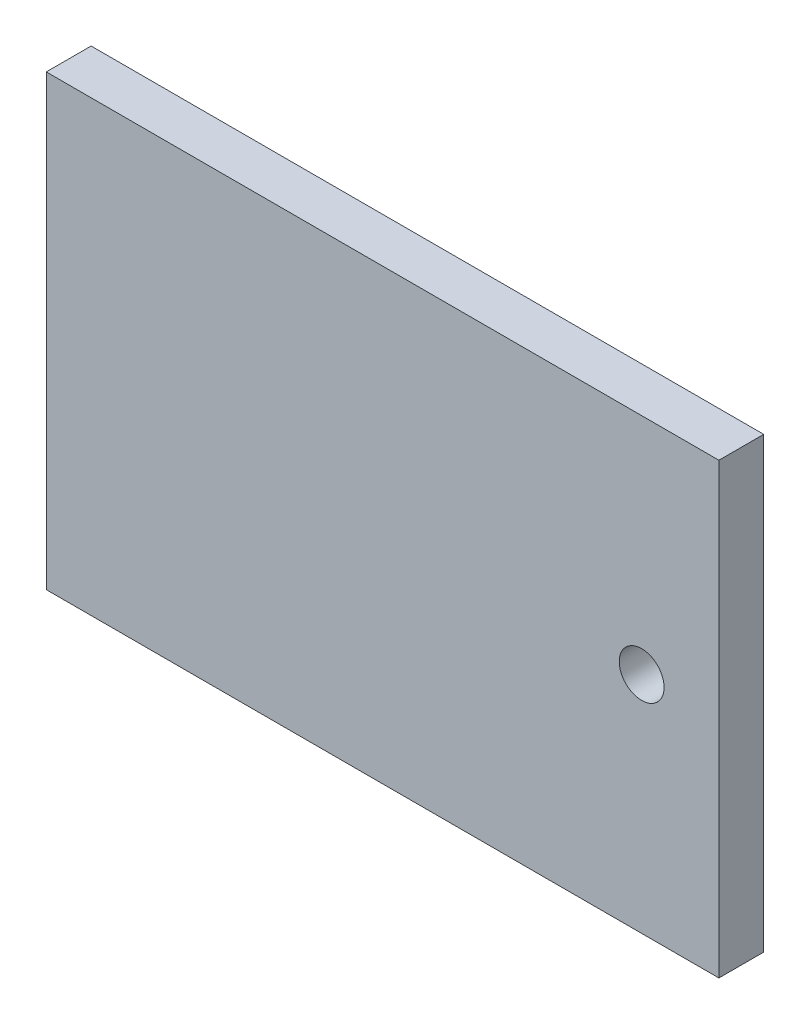
ISO-10303-21;
HEADER;
FILE_DESCRIPTION(('STEP AP214'),'2;1');
FILE_NAME('part.step','',(''),(''),'','','');
FILE_SCHEMA(('AUTOMOTIVE_DESIGN { 1 0 10303 214 1 1 1 1 }'));
ENDSEC;
DATA;
#1=APPLICATION_CONTEXT('core data for automotive mechanical design processes');
#2=APPLICATION_PROTOCOL_DEFINITION('international standard','automotive_design',2000,#1);
#3=PRODUCT_CONTEXT('',#1,'mechanical');
#4=PRODUCT('Part','Part','',(#3));
#5=PRODUCT_RELATED_PRODUCT_CATEGORY('part','',(#4));
#6=PRODUCT_DEFINITION_FORMATION('','',#4);
#7=PRODUCT_DEFINITION_CONTEXT('part definition',#1,'design');
#8=PRODUCT_DEFINITION('design','',#6,#7);
#9=PRODUCT_DEFINITION_SHAPE('','',#8);
#10=(LENGTH_UNIT() NAMED_UNIT(*) SI_UNIT(.MILLI.,.METRE.));
#11=(NAMED_UNIT(*) PLANE_ANGLE_UNIT() SI_UNIT($,.RADIAN.));
#12=(NAMED_UNIT(*) SI_UNIT($,.STERADIAN.) SOLID_ANGLE_UNIT());
#13=UNCERTAINTY_MEASURE_WITH_UNIT(LENGTH_MEASURE(1.E-05),#10,'distance_accuracy_value','');
#14=(GEOMETRIC_REPRESENTATION_CONTEXT(3) GLOBAL_UNCERTAINTY_ASSIGNED_CONTEXT((#13)) GLOBAL_UNIT_ASSIGNED_CONTEXT((#10,
#11,#12)) REPRESENTATION_CONTEXT('',''));
#15=CARTESIAN_POINT('',(0.,0.,0.));
#16=DIRECTION('',(0.,0.,1.));
#17=DIRECTION('',(1.,0.,0.));
#18=AXIS2_PLACEMENT_3D('',#15,#16,#17);
#19=CARTESIAN_POINT('',(15.,10.,2.));
#20=DIRECTION('',(-1.,0.,0.));
#21=DIRECTION('',(0.,-1.,0.));
#22=AXIS2_PLACEMENT_3D('',#19,#20,#21);
#23=PLANE('',#22);
#24=DIRECTION('',(0.,1.,0.));
#25=VECTOR('',#24,1.);
#26=CARTESIAN_POINT('',(15.,10.,0.));
#27=LINE('',#26,#25);
#28=CARTESIAN_POINT('',(15.,-10.,0.));
#29=VERTEX_POINT('',#28);
#30=CARTESIAN_POINT('',(15.,10.,0.));
#31=VERTEX_POINT('',#30);
#32=EDGE_CURVE('E111',#29,#31,#27,.T.);
#33=ORIENTED_EDGE('',*,*,#32,.T.);
#34=DIRECTION('',(0.,0.,-1.));
#35=VECTOR('',#34,1.);
#36=CARTESIAN_POINT('',(15.,10.,2.));
#37=LINE('',#36,#35);
#38=CARTESIAN_POINT('',(15.,10.,2.));
#39=VERTEX_POINT('',#38);
#40=EDGE_CURVE('E11',#39,#31,#37,.T.);
#41=ORIENTED_EDGE('',*,*,#40,.F.);
#42=DIRECTION('',(0.,1.,0.));
#43=VECTOR('',#42,1.);
#44=CARTESIAN_POINT('',(15.,10.,2.));
#45=LINE('',#44,#43);
#46=CARTESIAN_POINT('',(15.,-10.,2.));
#47=VERTEX_POINT('',#46);
#48=EDGE_CURVE('E95',#47,#39,#45,.T.);
#49=ORIENTED_EDGE('',*,*,#48,.F.);
#50=DIRECTION('',(0.,0.,-1.));
#51=VECTOR('',#50,1.);
#52=CARTESIAN_POINT('',(15.,-10.,2.));
#53=LINE('',#52,#51);
#54=EDGE_CURVE('E107',#47,#29,#53,.T.);
#55=ORIENTED_EDGE('',*,*,#54,.T.);
#56=EDGE_LOOP('',(#33,#41,#49,#55));
#57=FACE_BOUND('',#56,.T.);
#58=ADVANCED_FACE('F43',(#57),#23,.F.);
#59=CARTESIAN_POINT('',(-15.,10.,2.));
#60=DIRECTION('',(0.,-1.,0.));
#61=DIRECTION('',(0.,0.,-1.));
#62=AXIS2_PLACEMENT_3D('',#59,#60,#61);
#63=PLANE('',#62);
#64=DIRECTION('',(-1.,0.,0.));
#65=VECTOR('',#64,1.);
#66=CARTESIAN_POINT('',(-15.,10.,0.));
#67=LINE('',#66,#65);
#68=CARTESIAN_POINT('',(-15.,10.,0.));
#69=VERTEX_POINT('',#68);
#70=EDGE_CURVE('E100',#31,#69,#67,.T.);
#71=ORIENTED_EDGE('',*,*,#70,.T.);
#72=DIRECTION('',(0.,0.,-1.));
#73=VECTOR('',#72,1.);
#74=CARTESIAN_POINT('',(-15.,10.,2.));
#75=LINE('',#74,#73);
#76=CARTESIAN_POINT('',(-15.,10.,2.));
#77=VERTEX_POINT('',#76);
#78=EDGE_CURVE('E52',#77,#69,#75,.T.);
#79=ORIENTED_EDGE('',*,*,#78,.F.);
#80=DIRECTION('',(-1.,0.,0.));
#81=VECTOR('',#80,1.);
#82=CARTESIAN_POINT('',(-15.,10.,2.));
#83=LINE('',#82,#81);
#84=EDGE_CURVE('E90',#39,#77,#83,.T.);
#85=ORIENTED_EDGE('',*,*,#84,.F.);
#86=ORIENTED_EDGE('',*,*,#40,.T.);
#87=EDGE_LOOP('',(#71,#79,#85,#86));
#88=FACE_BOUND('',#87,.T.);
#89=ADVANCED_FACE('F99',(#88),#63,.F.);
#90=CARTESIAN_POINT('',(-15.,10.,2.));
#91=DIRECTION('',(1.,0.,0.));
#92=DIRECTION('',(0.,1.,0.));
#93=AXIS2_PLACEMENT_3D('',#90,#91,#92);
#94=PLANE('',#93);
#95=DIRECTION('',(0.,-1.,0.));
#96=VECTOR('',#95,1.);
#97=CARTESIAN_POINT('',(-15.,10.,0.));
#98=LINE('',#97,#96);
#99=CARTESIAN_POINT('',(-15.,-10.,0.));
#100=VERTEX_POINT('',#99);
#101=EDGE_CURVE('E77',#69,#100,#98,.T.);
#102=ORIENTED_EDGE('',*,*,#101,.T.);
#103=DIRECTION('',(0.,0.,-1.));
#104=VECTOR('',#103,1.);
#105=CARTESIAN_POINT('',(-15.,-10.,2.));
#106=LINE('',#105,#104);
#107=CARTESIAN_POINT('',(-15.,-10.,2.));
#108=VERTEX_POINT('',#107);
#109=EDGE_CURVE('E102',#108,#100,#106,.T.);
#110=ORIENTED_EDGE('',*,*,#109,.F.);
#111=DIRECTION('',(0.,-1.,0.));
#112=VECTOR('',#111,1.);
#113=CARTESIAN_POINT('',(-15.,10.,2.));
#114=LINE('',#113,#112);
#115=EDGE_CURVE('E93',#77,#108,#114,.T.);
#116=ORIENTED_EDGE('',*,*,#115,.F.);
#117=ORIENTED_EDGE('',*,*,#78,.T.);
#118=EDGE_LOOP('',(#102,#110,#116,#117));
#119=FACE_BOUND('',#118,.T.);
#120=ADVANCED_FACE('F103',(#119),#94,.F.);
#121=CARTESIAN_POINT('',(-15.,-10.,2.));
#122=DIRECTION('',(0.,1.,0.));
#123=DIRECTION('',(0.,0.,1.));
#124=AXIS2_PLACEMENT_3D('',#121,#122,#123);
#125=PLANE('',#124);
#126=DIRECTION('',(1.,0.,0.));
#127=VECTOR('',#126,1.);
#128=CARTESIAN_POINT('',(-15.,-10.,0.));
#129=LINE('',#128,#127);
#130=EDGE_CURVE('E83',#100,#29,#129,.T.);
#131=ORIENTED_EDGE('',*,*,#130,.T.);
#132=ORIENTED_EDGE('',*,*,#54,.F.);
#133=DIRECTION('',(1.,0.,0.));
#134=VECTOR('',#133,1.);
#135=CARTESIAN_POINT('',(-15.,-10.,2.));
#136=LINE('',#135,#134);
#137=EDGE_CURVE('E60',#108,#47,#136,.T.);
#138=ORIENTED_EDGE('',*,*,#137,.F.);
#139=ORIENTED_EDGE('',*,*,#109,.T.);
#140=EDGE_LOOP('',(#131,#132,#138,#139));
#141=FACE_BOUND('',#140,.T.);
#142=ADVANCED_FACE('F125',(#141),#125,.F.);
#143=CARTESIAN_POINT('',(0.,0.,2.));
#144=DIRECTION('',(0.,0.,1.));
#145=DIRECTION('',(1.,0.,0.));
#146=AXIS2_PLACEMENT_3D('',#143,#144,#145);
#147=PLANE('',#146);
#148=CARTESIAN_POINT('',(11.5553465090688,0.,2.));
#149=DIRECTION('',(0.,0.,1.));
#150=DIRECTION('',(1.,0.,0.));
#151=AXIS2_PLACEMENT_3D('',#148,#149,#150);
#152=CIRCLE('',#151,1.);
#153=CARTESIAN_POINT('',(12.5553465090688,0.,2.));
#154=VERTEX_POINT('',#153);
#155=EDGE_CURVE('E132',#154,#154,#152,.T.);
#156=ORIENTED_EDGE('',*,*,#155,.F.);
#157=EDGE_LOOP('',(#156));
#158=FACE_BOUND('',#157,.T.);
#159=ORIENTED_EDGE('',*,*,#48,.T.);
#160=ORIENTED_EDGE('',*,*,#84,.T.);
#161=ORIENTED_EDGE('',*,*,#115,.T.);
#162=ORIENTED_EDGE('',*,*,#137,.T.);
#163=EDGE_LOOP('',(#159,#160,#161,#162));
#164=FACE_BOUND('',#163,.T.);
#165=ADVANCED_FACE('F91',(#158,#164),#147,.T.);
#166=CARTESIAN_POINT('',(0.,0.,0.));
#167=DIRECTION('',(0.,0.,1.));
#168=DIRECTION('',(1.,0.,0.));
#169=AXIS2_PLACEMENT_3D('',#166,#167,#168);
#170=PLANE('',#169);
#171=CARTESIAN_POINT('',(11.5553465090688,0.,0.));
#172=DIRECTION('',(0.,0.,1.));
#173=DIRECTION('',(1.,0.,0.));
#174=AXIS2_PLACEMENT_3D('',#171,#172,#173);
#175=CIRCLE('',#174,1.);
#176=CARTESIAN_POINT('',(12.5553465090688,0.,0.));
#177=VERTEX_POINT('',#176);
#178=EDGE_CURVE('E115',#177,#177,#175,.T.);
#179=ORIENTED_EDGE('',*,*,#178,.T.);
#180=EDGE_LOOP('',(#179));
#181=FACE_BOUND('',#180,.T.);
#182=ORIENTED_EDGE('',*,*,#32,.F.);
#183=ORIENTED_EDGE('',*,*,#130,.F.);
#184=ORIENTED_EDGE('',*,*,#101,.F.);
#185=ORIENTED_EDGE('',*,*,#70,.F.);
#186=EDGE_LOOP('',(#182,#183,#184,#185));
#187=FACE_BOUND('',#186,.T.);
#188=ADVANCED_FACE('F128',(#181,#187),#170,.F.);
#189=CARTESIAN_POINT('',(11.5553465090688,0.,0.));
#190=DIRECTION('',(0.,0.,1.));
#191=DIRECTION('',(1.,0.,0.));
#192=AXIS2_PLACEMENT_3D('',#189,#190,#191);
#193=CYLINDRICAL_SURFACE('',#192,1.);
#194=ORIENTED_EDGE('',*,*,#178,.F.);
#195=EDGE_LOOP('',(#194));
#196=FACE_BOUND('',#195,.T.);
#197=ORIENTED_EDGE('',*,*,#155,.T.);
#198=EDGE_LOOP('',(#197));
#199=FACE_BOUND('',#198,.T.);
#200=ADVANCED_FACE('F141',(#196,#199),#193,.F.);
#201=CLOSED_SHELL('',(#58,#89,#120,#142,#165,#188,#200));
#202=MANIFOLD_SOLID_BREP('B2',#201);
#203=ADVANCED_BREP_SHAPE_REPRESENTATION('',(#18,#202),#14);
#204=SHAPE_DEFINITION_REPRESENTATION(#9,#203);
ENDSEC;
END-ISO-10303-21;
